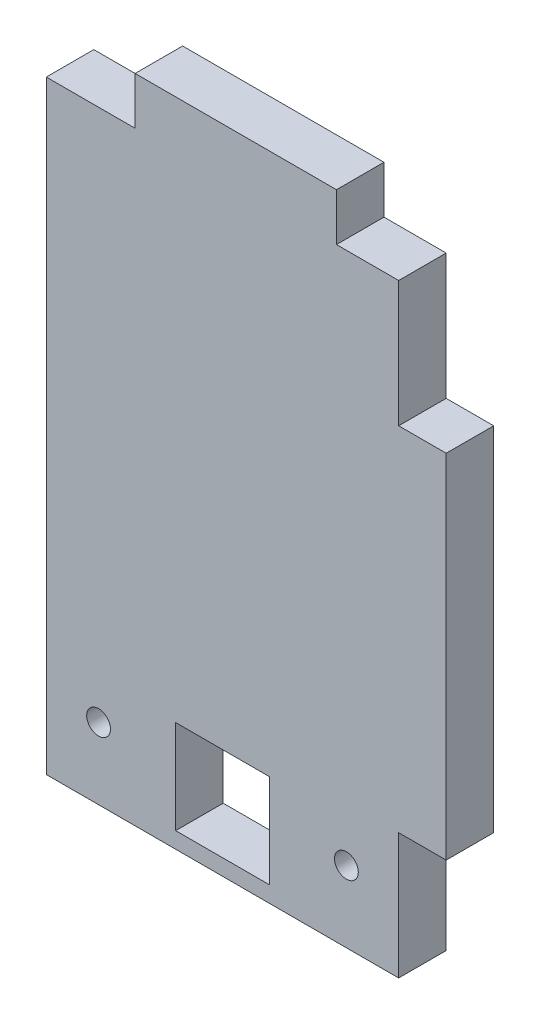
ISO-10303-21;
HEADER;
FILE_DESCRIPTION(('STEP AP214'),'2;1');
FILE_NAME('part.step','',(''),(''),'','','');
FILE_SCHEMA(('AUTOMOTIVE_DESIGN { 1 0 10303 214 1 1 1 1 }'));
ENDSEC;
DATA;
#1=APPLICATION_CONTEXT('core data for automotive mechanical design processes');
#2=APPLICATION_PROTOCOL_DEFINITION('international standard','automotive_design',2000,#1);
#3=PRODUCT_CONTEXT('',#1,'mechanical');
#4=PRODUCT('Part','Part','',(#3));
#5=PRODUCT_RELATED_PRODUCT_CATEGORY('part','',(#4));
#6=PRODUCT_DEFINITION_FORMATION('','',#4);
#7=PRODUCT_DEFINITION_CONTEXT('part definition',#1,'design');
#8=PRODUCT_DEFINITION('design','',#6,#7);
#9=PRODUCT_DEFINITION_SHAPE('','',#8);
#10=(LENGTH_UNIT() NAMED_UNIT(*) SI_UNIT(.MILLI.,.METRE.));
#11=(NAMED_UNIT(*) PLANE_ANGLE_UNIT() SI_UNIT($,.RADIAN.));
#12=(NAMED_UNIT(*) SI_UNIT($,.STERADIAN.) SOLID_ANGLE_UNIT());
#13=UNCERTAINTY_MEASURE_WITH_UNIT(LENGTH_MEASURE(1.E-05),#10,'distance_accuracy_value','');
#14=(GEOMETRIC_REPRESENTATION_CONTEXT(3) GLOBAL_UNCERTAINTY_ASSIGNED_CONTEXT((#13)) GLOBAL_UNIT_ASSIGNED_CONTEXT((#10,
#11,#12)) REPRESENTATION_CONTEXT('',''));
#15=CARTESIAN_POINT('',(0.,0.,0.));
#16=DIRECTION('',(0.,0.,1.));
#17=DIRECTION('',(1.,0.,0.));
#18=AXIS2_PLACEMENT_3D('',#15,#16,#17);
#19=CARTESIAN_POINT('',(0.,0.,5.9944));
#20=DIRECTION('',(0.,0.,1.));
#21=DIRECTION('',(1.,0.,0.));
#22=AXIS2_PLACEMENT_3D('',#19,#20,#21);
#23=PLANE('',#22);
#24=CARTESIAN_POINT('',(37.854999982,-67.199999966,5.9944));
#25=DIRECTION('',(0.,0.,1.));
#26=DIRECTION('',(1.,0.,0.));
#27=AXIS2_PLACEMENT_3D('',#24,#25,#26);
#28=CIRCLE('',#27,1.5);
#29=CARTESIAN_POINT('',(36.354999982,-67.199999966,5.9944));
#30=VERTEX_POINT('',#29);
#31=EDGE_CURVE('E195',#30,#30,#28,.T.);
#32=ORIENTED_EDGE('',*,*,#31,.F.);
#33=EDGE_LOOP('',(#32));
#34=FACE_BOUND('',#33,.T.);
#35=DIRECTION('',(0.,-1.,0.));
#36=VECTOR('',#35,1.);
#37=CARTESIAN_POINT('',(0.,0.,5.9944));
#38=LINE('',#37,#36);
#39=CARTESIAN_POINT('',(0.,0.,5.9944));
#40=VERTEX_POINT('',#39);
#41=CARTESIAN_POINT('',(0.,-76.2,5.9944));
#42=VERTEX_POINT('',#41);
#43=EDGE_CURVE('E201',#40,#42,#38,.T.);
#44=ORIENTED_EDGE('',*,*,#43,.T.);
#45=DIRECTION('',(1.,0.,0.));
#46=VECTOR('',#45,1.);
#47=CARTESIAN_POINT('',(0.,-76.2,5.9944));
#48=LINE('',#47,#46);
#49=CARTESIAN_POINT('',(44.45,-76.2,5.9944));
#50=VERTEX_POINT('',#49);
#51=EDGE_CURVE('E204',#42,#50,#48,.T.);
#52=ORIENTED_EDGE('',*,*,#51,.T.);
#53=DIRECTION('',(0.,1.,0.));
#54=VECTOR('',#53,1.);
#55=CARTESIAN_POINT('',(44.45,-60.325,5.9944));
#56=LINE('',#55,#54);
#57=CARTESIAN_POINT('',(44.45,-60.325,5.9944));
#58=VERTEX_POINT('',#57);
#59=EDGE_CURVE('E207',#50,#58,#56,.T.);
#60=ORIENTED_EDGE('',*,*,#59,.T.);
#61=DIRECTION('',(1.,0.,0.));
#62=VECTOR('',#61,1.);
#63=CARTESIAN_POINT('',(44.45,-60.325,5.9944));
#64=LINE('',#63,#62);
#65=CARTESIAN_POINT('',(50.4444,-60.325,5.9944));
#66=VERTEX_POINT('',#65);
#67=EDGE_CURVE('E209',#58,#66,#64,.T.);
#68=ORIENTED_EDGE('',*,*,#67,.T.);
#69=DIRECTION('',(0.,1.,0.));
#70=VECTOR('',#69,1.);
#71=CARTESIAN_POINT('',(50.4444,-60.325,5.9944));
#72=LINE('',#71,#70);
#73=CARTESIAN_POINT('',(50.4444,-15.875,5.9944));
#74=VERTEX_POINT('',#73);
#75=EDGE_CURVE('E211',#66,#74,#72,.T.);
#76=ORIENTED_EDGE('',*,*,#75,.T.);
#77=DIRECTION('',(-1.,0.,0.));
#78=VECTOR('',#77,1.);
#79=CARTESIAN_POINT('',(50.4444,-15.875,5.9944));
#80=LINE('',#79,#78);
#81=CARTESIAN_POINT('',(44.45,-15.875,5.9944));
#82=VERTEX_POINT('',#81);
#83=EDGE_CURVE('E213',#74,#82,#80,.T.);
#84=ORIENTED_EDGE('',*,*,#83,.T.);
#85=DIRECTION('',(0.,1.,0.));
#86=VECTOR('',#85,1.);
#87=CARTESIAN_POINT('',(44.45,0.,5.9944));
#88=LINE('',#87,#86);
#89=CARTESIAN_POINT('',(44.45,0.,5.9944));
#90=VERTEX_POINT('',#89);
#91=EDGE_CURVE('E215',#82,#90,#88,.T.);
#92=ORIENTED_EDGE('',*,*,#91,.T.);
#93=DIRECTION('',(-1.,0.,0.));
#94=VECTOR('',#93,1.);
#95=CARTESIAN_POINT('',(36.6034894811927,0.,5.9944));
#96=LINE('',#95,#94);
#97=CARTESIAN_POINT('',(36.6034894811927,0.,5.9944));
#98=VERTEX_POINT('',#97);
#99=EDGE_CURVE('E217',#90,#98,#96,.T.);
#100=ORIENTED_EDGE('',*,*,#99,.T.);
#101=DIRECTION('',(0.,1.,0.));
#102=VECTOR('',#101,1.);
#103=CARTESIAN_POINT('',(36.6034894811927,5.9944,5.9944));
#104=LINE('',#103,#102);
#105=CARTESIAN_POINT('',(36.6034894811927,5.9944,5.9944));
#106=VERTEX_POINT('',#105);
#107=EDGE_CURVE('E219',#98,#106,#104,.T.);
#108=ORIENTED_EDGE('',*,*,#107,.T.);
#109=DIRECTION('',(-1.,0.,0.));
#110=VECTOR('',#109,1.);
#111=CARTESIAN_POINT('',(11.2034894811927,5.9944,5.9944));
#112=LINE('',#111,#110);
#113=CARTESIAN_POINT('',(11.2034894811927,5.9944,5.9944));
#114=VERTEX_POINT('',#113);
#115=EDGE_CURVE('E221',#106,#114,#112,.T.);
#116=ORIENTED_EDGE('',*,*,#115,.T.);
#117=DIRECTION('',(0.,-1.,0.));
#118=VECTOR('',#117,1.);
#119=CARTESIAN_POINT('',(11.2034894811927,0.,5.9944));
#120=LINE('',#119,#118);
#121=CARTESIAN_POINT('',(11.2034894811927,0.,5.9944));
#122=VERTEX_POINT('',#121);
#123=EDGE_CURVE('E223',#114,#122,#120,.T.);
#124=ORIENTED_EDGE('',*,*,#123,.T.);
#125=DIRECTION('',(-1.,0.,0.));
#126=VECTOR('',#125,1.);
#127=CARTESIAN_POINT('',(0.,0.,5.9944));
#128=LINE('',#127,#126);
#129=EDGE_CURVE('E225',#122,#40,#128,.T.);
#130=ORIENTED_EDGE('',*,*,#129,.T.);
#131=EDGE_LOOP('',(#44,#52,#60,#68,#76,#84,#92,#100,#108,#116,#124,#130));
#132=FACE_BOUND('',#131,.T.);
#133=CARTESIAN_POINT('',(6.595000018,-67.199999966,5.9944));
#134=DIRECTION('',(0.,0.,1.));
#135=DIRECTION('',(1.,0.,0.));
#136=AXIS2_PLACEMENT_3D('',#133,#134,#135);
#137=CIRCLE('',#136,1.5);
#138=CARTESIAN_POINT('',(5.095000018,-67.199999966,5.9944));
#139=VERTEX_POINT('',#138);
#140=EDGE_CURVE('E189',#139,#139,#137,.T.);
#141=ORIENTED_EDGE('',*,*,#140,.F.);
#142=EDGE_LOOP('',(#141));
#143=FACE_BOUND('',#142,.T.);
#144=DIRECTION('',(1.,0.,0.));
#145=VECTOR('',#144,1.);
#146=CARTESIAN_POINT('',(16.3195,-74.168,5.9944));
#147=LINE('',#146,#145);
#148=CARTESIAN_POINT('',(16.3195,-74.168,5.9944));
#149=VERTEX_POINT('',#148);
#150=CARTESIAN_POINT('',(28.1305,-74.168,5.9944));
#151=VERTEX_POINT('',#150);
#152=EDGE_CURVE('E161',#149,#151,#147,.T.);
#153=ORIENTED_EDGE('',*,*,#152,.F.);
#154=DIRECTION('',(0.,-1.,0.));
#155=VECTOR('',#154,1.);
#156=CARTESIAN_POINT('',(16.3195,-62.357,5.9944));
#157=LINE('',#156,#155);
#158=CARTESIAN_POINT('',(16.3195,-62.357,5.9944));
#159=VERTEX_POINT('',#158);
#160=EDGE_CURVE('E153',#159,#149,#157,.T.);
#161=ORIENTED_EDGE('',*,*,#160,.F.);
#162=DIRECTION('',(-1.,0.,0.));
#163=VECTOR('',#162,1.);
#164=CARTESIAN_POINT('',(16.3195,-62.357,5.9944));
#165=LINE('',#164,#163);
#166=CARTESIAN_POINT('',(28.1305,-62.357,5.9944));
#167=VERTEX_POINT('',#166);
#168=EDGE_CURVE('E175',#167,#159,#165,.T.);
#169=ORIENTED_EDGE('',*,*,#168,.F.);
#170=DIRECTION('',(0.,1.,0.));
#171=VECTOR('',#170,1.);
#172=CARTESIAN_POINT('',(28.1305,-62.357,5.9944));
#173=LINE('',#172,#171);
#174=EDGE_CURVE('E173',#151,#167,#173,.T.);
#175=ORIENTED_EDGE('',*,*,#174,.F.);
#176=EDGE_LOOP('',(#153,#161,#169,#175));
#177=FACE_BOUND('',#176,.T.);
#178=ADVANCED_FACE('F40',(#34,#132,#143,#177),#23,.T.);
#179=CARTESIAN_POINT('',(0.,0.,0.));
#180=DIRECTION('',(0.,0.,1.));
#181=DIRECTION('',(1.,0.,0.));
#182=AXIS2_PLACEMENT_3D('',#179,#180,#181);
#183=PLANE('',#182);
#184=CARTESIAN_POINT('',(6.595000018,-67.199999966,0.));
#185=DIRECTION('',(0.,0.,1.));
#186=DIRECTION('',(1.,0.,0.));
#187=AXIS2_PLACEMENT_3D('',#184,#185,#186);
#188=CIRCLE('',#187,1.5);
#189=CARTESIAN_POINT('',(5.095000018,-67.199999966,0.));
#190=VERTEX_POINT('',#189);
#191=EDGE_CURVE('E169',#190,#190,#188,.T.);
#192=ORIENTED_EDGE('',*,*,#191,.T.);
#193=EDGE_LOOP('',(#192));
#194=FACE_BOUND('',#193,.T.);
#195=CARTESIAN_POINT('',(37.854999982,-67.199999966,0.));
#196=DIRECTION('',(0.,0.,1.));
#197=DIRECTION('',(1.,0.,0.));
#198=AXIS2_PLACEMENT_3D('',#195,#196,#197);
#199=CIRCLE('',#198,1.5);
#200=CARTESIAN_POINT('',(36.354999982,-67.199999966,0.));
#201=VERTEX_POINT('',#200);
#202=EDGE_CURVE('E192',#201,#201,#199,.T.);
#203=ORIENTED_EDGE('',*,*,#202,.T.);
#204=EDGE_LOOP('',(#203));
#205=FACE_BOUND('',#204,.T.);
#206=DIRECTION('',(0.,-1.,0.));
#207=VECTOR('',#206,1.);
#208=CARTESIAN_POINT('',(0.,0.,0.));
#209=LINE('',#208,#207);
#210=CARTESIAN_POINT('',(0.,0.,0.));
#211=VERTEX_POINT('',#210);
#212=CARTESIAN_POINT('',(0.,-76.2,0.));
#213=VERTEX_POINT('',#212);
#214=EDGE_CURVE('E198',#211,#213,#209,.T.);
#215=ORIENTED_EDGE('',*,*,#214,.F.);
#216=DIRECTION('',(-1.,0.,0.));
#217=VECTOR('',#216,1.);
#218=CARTESIAN_POINT('',(0.,0.,0.));
#219=LINE('',#218,#217);
#220=CARTESIAN_POINT('',(11.2034894811927,0.,0.));
#221=VERTEX_POINT('',#220);
#222=EDGE_CURVE('E205',#221,#211,#219,.T.);
#223=ORIENTED_EDGE('',*,*,#222,.F.);
#224=DIRECTION('',(0.,-1.,0.));
#225=VECTOR('',#224,1.);
#226=CARTESIAN_POINT('',(11.2034894811927,0.,0.));
#227=LINE('',#226,#225);
#228=CARTESIAN_POINT('',(11.2034894811927,5.9944,0.));
#229=VERTEX_POINT('',#228);
#230=EDGE_CURVE('E248',#229,#221,#227,.T.);
#231=ORIENTED_EDGE('',*,*,#230,.F.);
#232=DIRECTION('',(-1.,0.,0.));
#233=VECTOR('',#232,1.);
#234=CARTESIAN_POINT('',(11.2034894811927,5.9944,0.));
#235=LINE('',#234,#233);
#236=CARTESIAN_POINT('',(36.6034894811927,5.9944,0.));
#237=VERTEX_POINT('',#236);
#238=EDGE_CURVE('E246',#237,#229,#235,.T.);
#239=ORIENTED_EDGE('',*,*,#238,.F.);
#240=DIRECTION('',(0.,1.,0.));
#241=VECTOR('',#240,1.);
#242=CARTESIAN_POINT('',(36.6034894811927,5.9944,0.));
#243=LINE('',#242,#241);
#244=CARTESIAN_POINT('',(36.6034894811927,0.,0.));
#245=VERTEX_POINT('',#244);
#246=EDGE_CURVE('E244',#245,#237,#243,.T.);
#247=ORIENTED_EDGE('',*,*,#246,.F.);
#248=DIRECTION('',(-1.,0.,0.));
#249=VECTOR('',#248,1.);
#250=CARTESIAN_POINT('',(36.6034894811927,0.,0.));
#251=LINE('',#250,#249);
#252=CARTESIAN_POINT('',(44.45,0.,0.));
#253=VERTEX_POINT('',#252);
#254=EDGE_CURVE('E242',#253,#245,#251,.T.);
#255=ORIENTED_EDGE('',*,*,#254,.F.);
#256=DIRECTION('',(0.,1.,0.));
#257=VECTOR('',#256,1.);
#258=CARTESIAN_POINT('',(44.45,0.,0.));
#259=LINE('',#258,#257);
#260=CARTESIAN_POINT('',(44.45,-15.875,0.));
#261=VERTEX_POINT('',#260);
#262=EDGE_CURVE('E240',#261,#253,#259,.T.);
#263=ORIENTED_EDGE('',*,*,#262,.F.);
#264=DIRECTION('',(-1.,0.,0.));
#265=VECTOR('',#264,1.);
#266=CARTESIAN_POINT('',(50.4444,-15.875,0.));
#267=LINE('',#266,#265);
#268=CARTESIAN_POINT('',(50.4444,-15.875,0.));
#269=VERTEX_POINT('',#268);
#270=EDGE_CURVE('E238',#269,#261,#267,.T.);
#271=ORIENTED_EDGE('',*,*,#270,.F.);
#272=DIRECTION('',(0.,1.,0.));
#273=VECTOR('',#272,1.);
#274=CARTESIAN_POINT('',(50.4444,-60.325,0.));
#275=LINE('',#274,#273);
#276=CARTESIAN_POINT('',(50.4444,-60.325,0.));
#277=VERTEX_POINT('',#276);
#278=EDGE_CURVE('E236',#277,#269,#275,.T.);
#279=ORIENTED_EDGE('',*,*,#278,.F.);
#280=DIRECTION('',(1.,0.,0.));
#281=VECTOR('',#280,1.);
#282=CARTESIAN_POINT('',(44.45,-60.325,0.));
#283=LINE('',#282,#281);
#284=CARTESIAN_POINT('',(44.45,-60.325,0.));
#285=VERTEX_POINT('',#284);
#286=EDGE_CURVE('E234',#285,#277,#283,.T.);
#287=ORIENTED_EDGE('',*,*,#286,.F.);
#288=DIRECTION('',(0.,1.,0.));
#289=VECTOR('',#288,1.);
#290=CARTESIAN_POINT('',(44.45,-60.325,0.));
#291=LINE('',#290,#289);
#292=CARTESIAN_POINT('',(44.45,-76.2,0.));
#293=VERTEX_POINT('',#292);
#294=EDGE_CURVE('E232',#293,#285,#291,.T.);
#295=ORIENTED_EDGE('',*,*,#294,.F.);
#296=DIRECTION('',(1.,0.,0.));
#297=VECTOR('',#296,1.);
#298=CARTESIAN_POINT('',(0.,-76.2,0.));
#299=LINE('',#298,#297);
#300=EDGE_CURVE('E230',#213,#293,#299,.T.);
#301=ORIENTED_EDGE('',*,*,#300,.F.);
#302=EDGE_LOOP('',(#215,#223,#231,#239,#247,#255,#263,#271,#279,#287,#295,#301));
#303=FACE_BOUND('',#302,.T.);
#304=DIRECTION('',(0.,-1.,0.));
#305=VECTOR('',#304,1.);
#306=CARTESIAN_POINT('',(16.3195,-62.357,0.));
#307=LINE('',#306,#305);
#308=CARTESIAN_POINT('',(16.3195,-62.357,0.));
#309=VERTEX_POINT('',#308);
#310=CARTESIAN_POINT('',(16.3195,-74.168,0.));
#311=VERTEX_POINT('',#310);
#312=EDGE_CURVE('E63',#309,#311,#307,.T.);
#313=ORIENTED_EDGE('',*,*,#312,.T.);
#314=DIRECTION('',(1.,0.,0.));
#315=VECTOR('',#314,1.);
#316=CARTESIAN_POINT('',(16.3195,-74.168,0.));
#317=LINE('',#316,#315);
#318=CARTESIAN_POINT('',(28.1305,-74.168,0.));
#319=VERTEX_POINT('',#318);
#320=EDGE_CURVE('E168',#311,#319,#317,.T.);
#321=ORIENTED_EDGE('',*,*,#320,.T.);
#322=DIRECTION('',(0.,1.,0.));
#323=VECTOR('',#322,1.);
#324=CARTESIAN_POINT('',(28.1305,-62.357,0.));
#325=LINE('',#324,#323);
#326=CARTESIAN_POINT('',(28.1305,-62.357,0.));
#327=VERTEX_POINT('',#326);
#328=EDGE_CURVE('E181',#319,#327,#325,.T.);
#329=ORIENTED_EDGE('',*,*,#328,.T.);
#330=DIRECTION('',(-1.,0.,0.));
#331=VECTOR('',#330,1.);
#332=CARTESIAN_POINT('',(16.3195,-62.357,0.));
#333=LINE('',#332,#331);
#334=EDGE_CURVE('E162',#327,#309,#333,.T.);
#335=ORIENTED_EDGE('',*,*,#334,.T.);
#336=EDGE_LOOP('',(#313,#321,#329,#335));
#337=FACE_BOUND('',#336,.T.);
#338=ADVANCED_FACE('F290',(#194,#205,#303,#337),#183,.F.);
#339=CARTESIAN_POINT('',(0.,0.,5.9944));
#340=DIRECTION('',(1.,0.,0.));
#341=DIRECTION('',(0.,1.,0.));
#342=AXIS2_PLACEMENT_3D('',#339,#340,#341);
#343=PLANE('',#342);
#344=ORIENTED_EDGE('',*,*,#214,.T.);
#345=DIRECTION('',(0.,0.,-1.));
#346=VECTOR('',#345,1.);
#347=CARTESIAN_POINT('',(0.,-76.2,5.9944));
#348=LINE('',#347,#346);
#349=EDGE_CURVE('E11',#42,#213,#348,.T.);
#350=ORIENTED_EDGE('',*,*,#349,.F.);
#351=ORIENTED_EDGE('',*,*,#43,.F.);
#352=DIRECTION('',(0.,0.,-1.));
#353=VECTOR('',#352,1.);
#354=CARTESIAN_POINT('',(0.,0.,5.9944));
#355=LINE('',#354,#353);
#356=EDGE_CURVE('E227',#40,#211,#355,.T.);
#357=ORIENTED_EDGE('',*,*,#356,.T.);
#358=EDGE_LOOP('',(#344,#350,#351,#357));
#359=FACE_BOUND('',#358,.T.);
#360=ADVANCED_FACE('F42',(#359),#343,.F.);
#361=CARTESIAN_POINT('',(0.,-76.2,5.9944));
#362=DIRECTION('',(0.,1.,0.));
#363=DIRECTION('',(0.,0.,1.));
#364=AXIS2_PLACEMENT_3D('',#361,#362,#363);
#365=PLANE('',#364);
#366=ORIENTED_EDGE('',*,*,#300,.T.);
#367=DIRECTION('',(0.,0.,-1.));
#368=VECTOR('',#367,1.);
#369=CARTESIAN_POINT('',(44.45,-76.2,5.9944));
#370=LINE('',#369,#368);
#371=EDGE_CURVE('E48',#50,#293,#370,.T.);
#372=ORIENTED_EDGE('',*,*,#371,.F.);
#373=ORIENTED_EDGE('',*,*,#51,.F.);
#374=ORIENTED_EDGE('',*,*,#349,.T.);
#375=EDGE_LOOP('',(#366,#372,#373,#374));
#376=FACE_BOUND('',#375,.T.);
#377=ADVANCED_FACE('F308',(#376),#365,.F.);
#378=CARTESIAN_POINT('',(44.45,-60.325,5.9944));
#379=DIRECTION('',(-1.,0.,0.));
#380=DIRECTION('',(0.,0.,1.));
#381=AXIS2_PLACEMENT_3D('',#378,#379,#380);
#382=PLANE('',#381);
#383=ORIENTED_EDGE('',*,*,#294,.T.);
#384=DIRECTION('',(0.,0.,-1.));
#385=VECTOR('',#384,1.);
#386=CARTESIAN_POINT('',(44.45,-60.325,5.9944));
#387=LINE('',#386,#385);
#388=EDGE_CURVE('E277',#58,#285,#387,.T.);
#389=ORIENTED_EDGE('',*,*,#388,.F.);
#390=ORIENTED_EDGE('',*,*,#59,.F.);
#391=ORIENTED_EDGE('',*,*,#371,.T.);
#392=EDGE_LOOP('',(#383,#389,#390,#391));
#393=FACE_BOUND('',#392,.T.);
#394=ADVANCED_FACE('F284',(#393),#382,.F.);
#395=CARTESIAN_POINT('',(44.45,-60.325,5.9944));
#396=DIRECTION('',(0.,1.,0.));
#397=DIRECTION('',(0.,0.,1.));
#398=AXIS2_PLACEMENT_3D('',#395,#396,#397);
#399=PLANE('',#398);
#400=ORIENTED_EDGE('',*,*,#286,.T.);
#401=DIRECTION('',(0.,0.,-1.));
#402=VECTOR('',#401,1.);
#403=CARTESIAN_POINT('',(50.4444,-60.325,5.9944));
#404=LINE('',#403,#402);
#405=EDGE_CURVE('E274',#66,#277,#404,.T.);
#406=ORIENTED_EDGE('',*,*,#405,.F.);
#407=ORIENTED_EDGE('',*,*,#67,.F.);
#408=ORIENTED_EDGE('',*,*,#388,.T.);
#409=EDGE_LOOP('',(#400,#406,#407,#408));
#410=FACE_BOUND('',#409,.T.);
#411=ADVANCED_FACE('F296',(#410),#399,.F.);
#412=CARTESIAN_POINT('',(50.4444,-60.325,5.9944));
#413=DIRECTION('',(-1.,0.,0.));
#414=DIRECTION('',(0.,0.,1.));
#415=AXIS2_PLACEMENT_3D('',#412,#413,#414);
#416=PLANE('',#415);
#417=ORIENTED_EDGE('',*,*,#278,.T.);
#418=DIRECTION('',(0.,0.,-1.));
#419=VECTOR('',#418,1.);
#420=CARTESIAN_POINT('',(50.4444,-15.875,5.9944));
#421=LINE('',#420,#419);
#422=EDGE_CURVE('E271',#74,#269,#421,.T.);
#423=ORIENTED_EDGE('',*,*,#422,.F.);
#424=ORIENTED_EDGE('',*,*,#75,.F.);
#425=ORIENTED_EDGE('',*,*,#405,.T.);
#426=EDGE_LOOP('',(#417,#423,#424,#425));
#427=FACE_BOUND('',#426,.T.);
#428=ADVANCED_FACE('F300',(#427),#416,.F.);
#429=CARTESIAN_POINT('',(50.4444,-15.875,5.9944));
#430=DIRECTION('',(0.,-1.,0.));
#431=DIRECTION('',(0.,0.,-1.));
#432=AXIS2_PLACEMENT_3D('',#429,#430,#431);
#433=PLANE('',#432);
#434=ORIENTED_EDGE('',*,*,#270,.T.);
#435=DIRECTION('',(0.,0.,-1.));
#436=VECTOR('',#435,1.);
#437=CARTESIAN_POINT('',(44.45,-15.875,5.9944));
#438=LINE('',#437,#436);
#439=EDGE_CURVE('E268',#82,#261,#438,.T.);
#440=ORIENTED_EDGE('',*,*,#439,.F.);
#441=ORIENTED_EDGE('',*,*,#83,.F.);
#442=ORIENTED_EDGE('',*,*,#422,.T.);
#443=EDGE_LOOP('',(#434,#440,#441,#442));
#444=FACE_BOUND('',#443,.T.);
#445=ADVANCED_FACE('F341',(#444),#433,.F.);
#446=CARTESIAN_POINT('',(44.45,0.,5.9944));
#447=DIRECTION('',(-1.,0.,0.));
#448=DIRECTION('',(0.,-1.,0.));
#449=AXIS2_PLACEMENT_3D('',#446,#447,#448);
#450=PLANE('',#449);
#451=ORIENTED_EDGE('',*,*,#262,.T.);
#452=DIRECTION('',(0.,0.,-1.));
#453=VECTOR('',#452,1.);
#454=CARTESIAN_POINT('',(44.45,0.,5.9944));
#455=LINE('',#454,#453);
#456=EDGE_CURVE('E265',#90,#253,#455,.T.);
#457=ORIENTED_EDGE('',*,*,#456,.F.);
#458=ORIENTED_EDGE('',*,*,#91,.F.);
#459=ORIENTED_EDGE('',*,*,#439,.T.);
#460=EDGE_LOOP('',(#451,#457,#458,#459));
#461=FACE_BOUND('',#460,.T.);
#462=ADVANCED_FACE('F339',(#461),#450,.F.);
#463=CARTESIAN_POINT('',(36.6034894811927,0.,5.9944));
#464=DIRECTION('',(0.,-1.,0.));
#465=DIRECTION('',(0.,0.,-1.));
#466=AXIS2_PLACEMENT_3D('',#463,#464,#465);
#467=PLANE('',#466);
#468=ORIENTED_EDGE('',*,*,#254,.T.);
#469=DIRECTION('',(0.,0.,-1.));
#470=VECTOR('',#469,1.);
#471=CARTESIAN_POINT('',(36.6034894811927,0.,5.9944));
#472=LINE('',#471,#470);
#473=EDGE_CURVE('E262',#98,#245,#472,.T.);
#474=ORIENTED_EDGE('',*,*,#473,.F.);
#475=ORIENTED_EDGE('',*,*,#99,.F.);
#476=ORIENTED_EDGE('',*,*,#456,.T.);
#477=EDGE_LOOP('',(#468,#474,#475,#476));
#478=FACE_BOUND('',#477,.T.);
#479=ADVANCED_FACE('F335',(#478),#467,.F.);
#480=CARTESIAN_POINT('',(36.6034894811927,5.9944,5.9944));
#481=DIRECTION('',(-1.,0.,0.));
#482=DIRECTION('',(0.,0.,1.));
#483=AXIS2_PLACEMENT_3D('',#480,#481,#482);
#484=PLANE('',#483);
#485=ORIENTED_EDGE('',*,*,#246,.T.);
#486=DIRECTION('',(0.,0.,-1.));
#487=VECTOR('',#486,1.);
#488=CARTESIAN_POINT('',(36.6034894811927,5.9944,5.9944));
#489=LINE('',#488,#487);
#490=EDGE_CURVE('E259',#106,#237,#489,.T.);
#491=ORIENTED_EDGE('',*,*,#490,.F.);
#492=ORIENTED_EDGE('',*,*,#107,.F.);
#493=ORIENTED_EDGE('',*,*,#473,.T.);
#494=EDGE_LOOP('',(#485,#491,#492,#493));
#495=FACE_BOUND('',#494,.T.);
#496=ADVANCED_FACE('F330',(#495),#484,.F.);
#497=CARTESIAN_POINT('',(11.2034894811927,5.9944,5.9944));
#498=DIRECTION('',(0.,-1.,0.));
#499=DIRECTION('',(0.,0.,-1.));
#500=AXIS2_PLACEMENT_3D('',#497,#498,#499);
#501=PLANE('',#500);
#502=ORIENTED_EDGE('',*,*,#238,.T.);
#503=DIRECTION('',(0.,0.,-1.));
#504=VECTOR('',#503,1.);
#505=CARTESIAN_POINT('',(11.2034894811927,5.9944,5.9944));
#506=LINE('',#505,#504);
#507=EDGE_CURVE('E256',#114,#229,#506,.T.);
#508=ORIENTED_EDGE('',*,*,#507,.F.);
#509=ORIENTED_EDGE('',*,*,#115,.F.);
#510=ORIENTED_EDGE('',*,*,#490,.T.);
#511=EDGE_LOOP('',(#502,#508,#509,#510));
#512=FACE_BOUND('',#511,.T.);
#513=ADVANCED_FACE('F324',(#512),#501,.F.);
#514=CARTESIAN_POINT('',(11.2034894811927,0.,5.9944));
#515=DIRECTION('',(1.,0.,0.));
#516=DIRECTION('',(0.,0.,-1.));
#517=AXIS2_PLACEMENT_3D('',#514,#515,#516);
#518=PLANE('',#517);
#519=ORIENTED_EDGE('',*,*,#230,.T.);
#520=DIRECTION('',(0.,0.,-1.));
#521=VECTOR('',#520,1.);
#522=CARTESIAN_POINT('',(11.2034894811927,0.,5.9944));
#523=LINE('',#522,#521);
#524=EDGE_CURVE('E253',#122,#221,#523,.T.);
#525=ORIENTED_EDGE('',*,*,#524,.F.);
#526=ORIENTED_EDGE('',*,*,#123,.F.);
#527=ORIENTED_EDGE('',*,*,#507,.T.);
#528=EDGE_LOOP('',(#519,#525,#526,#527));
#529=FACE_BOUND('',#528,.T.);
#530=ADVANCED_FACE('F320',(#529),#518,.F.);
#531=CARTESIAN_POINT('',(0.,0.,5.9944));
#532=DIRECTION('',(0.,-1.,0.));
#533=DIRECTION('',(0.,0.,-1.));
#534=AXIS2_PLACEMENT_3D('',#531,#532,#533);
#535=PLANE('',#534);
#536=ORIENTED_EDGE('',*,*,#222,.T.);
#537=ORIENTED_EDGE('',*,*,#356,.F.);
#538=ORIENTED_EDGE('',*,*,#129,.F.);
#539=ORIENTED_EDGE('',*,*,#524,.T.);
#540=EDGE_LOOP('',(#536,#537,#538,#539));
#541=FACE_BOUND('',#540,.T.);
#542=ADVANCED_FACE('F315',(#541),#535,.F.);
#543=CARTESIAN_POINT('',(37.854999982,-67.199999966,5.9944));
#544=DIRECTION('',(0.,0.,-1.));
#545=DIRECTION('',(-1.,0.,0.));
#546=AXIS2_PLACEMENT_3D('',#543,#544,#545);
#547=CYLINDRICAL_SURFACE('',#546,1.5);
#548=CARTESIAN_POINT('',(36.354999982,-67.199999966,5.9944));
#549=CARTESIAN_POINT('',(36.354999982,-67.199999966,5.93195833333333));
#550=CARTESIAN_POINT('',(36.354999982,-67.199999966,5.86951666666667));
#551=CARTESIAN_POINT('',(36.354999982,-67.199999966,5.74463333333333));
#552=CARTESIAN_POINT('',(36.354999982,-67.199999966,5.68219166666667));
#553=CARTESIAN_POINT('',(36.354999982,-67.199999966,5.55730833333333));
#554=CARTESIAN_POINT('',(36.354999982,-67.199999966,5.49486666666667));
#555=CARTESIAN_POINT('',(36.354999982,-67.199999966,5.36998333333333));
#556=CARTESIAN_POINT('',(36.354999982,-67.199999966,5.30754166666667));
#557=CARTESIAN_POINT('',(36.354999982,-67.199999966,5.18265833333333));
#558=CARTESIAN_POINT('',(36.354999982,-67.199999966,5.12021666666667));
#559=CARTESIAN_POINT('',(36.354999982,-67.199999966,4.99533333333333));
#560=CARTESIAN_POINT('',(36.354999982,-67.199999966,4.93289166666667));
#561=CARTESIAN_POINT('',(36.354999982,-67.199999966,4.80800833333333));
#562=CARTESIAN_POINT('',(36.354999982,-67.199999966,4.74556666666667));
#563=CARTESIAN_POINT('',(36.354999982,-67.199999966,4.62068333333333));
#564=CARTESIAN_POINT('',(36.354999982,-67.199999966,4.55824166666667));
#565=CARTESIAN_POINT('',(36.354999982,-67.199999966,4.43335833333333));
#566=CARTESIAN_POINT('',(36.354999982,-67.199999966,4.37091666666667));
#567=CARTESIAN_POINT('',(36.354999982,-67.199999966,4.24603333333333));
#568=CARTESIAN_POINT('',(36.354999982,-67.199999966,4.18359166666667));
#569=CARTESIAN_POINT('',(36.354999982,-67.199999966,4.05870833333333));
#570=CARTESIAN_POINT('',(36.354999982,-67.199999966,3.99626666666667));
#571=CARTESIAN_POINT('',(36.354999982,-67.199999966,3.87138333333333));
#572=CARTESIAN_POINT('',(36.354999982,-67.199999966,3.80894166666667));
#573=CARTESIAN_POINT('',(36.354999982,-67.199999966,3.68405833333333));
#574=CARTESIAN_POINT('',(36.354999982,-67.199999966,3.62161666666667));
#575=CARTESIAN_POINT('',(36.354999982,-67.199999966,3.49673333333333));
#576=CARTESIAN_POINT('',(36.354999982,-67.199999966,3.43429166666667));
#577=CARTESIAN_POINT('',(36.354999982,-67.199999966,3.30940833333333));
#578=CARTESIAN_POINT('',(36.354999982,-67.199999966,3.24696666666667));
#579=CARTESIAN_POINT('',(36.354999982,-67.199999966,3.12208333333333));
#580=CARTESIAN_POINT('',(36.354999982,-67.199999966,3.05964166666667));
#581=CARTESIAN_POINT('',(36.354999982,-67.199999966,2.93475833333333));
#582=CARTESIAN_POINT('',(36.354999982,-67.199999966,2.87231666666667));
#583=CARTESIAN_POINT('',(36.354999982,-67.199999966,2.74743333333333));
#584=CARTESIAN_POINT('',(36.354999982,-67.199999966,2.68499166666667));
#585=CARTESIAN_POINT('',(36.354999982,-67.199999966,2.56010833333333));
#586=CARTESIAN_POINT('',(36.354999982,-67.199999966,2.49766666666667));
#587=CARTESIAN_POINT('',(36.354999982,-67.199999966,2.37278333333333));
#588=CARTESIAN_POINT('',(36.354999982,-67.199999966,2.31034166666667));
#589=CARTESIAN_POINT('',(36.354999982,-67.199999966,2.18545833333333));
#590=CARTESIAN_POINT('',(36.354999982,-67.199999966,2.12301666666667));
#591=CARTESIAN_POINT('',(36.354999982,-67.199999966,1.99813333333333));
#592=CARTESIAN_POINT('',(36.354999982,-67.199999966,1.93569166666667));
#593=CARTESIAN_POINT('',(36.354999982,-67.199999966,1.81080833333333));
#594=CARTESIAN_POINT('',(36.354999982,-67.199999966,1.74836666666667));
#595=CARTESIAN_POINT('',(36.354999982,-67.199999966,1.62348333333333));
#596=CARTESIAN_POINT('',(36.354999982,-67.199999966,1.56104166666667));
#597=CARTESIAN_POINT('',(36.354999982,-67.199999966,1.43615833333333));
#598=CARTESIAN_POINT('',(36.354999982,-67.199999966,1.37371666666667));
#599=CARTESIAN_POINT('',(36.354999982,-67.199999966,1.24883333333333));
#600=CARTESIAN_POINT('',(36.354999982,-67.199999966,1.18639166666667));
#601=CARTESIAN_POINT('',(36.354999982,-67.199999966,1.06150833333333));
#602=CARTESIAN_POINT('',(36.354999982,-67.199999966,0.999066666666667));
#603=CARTESIAN_POINT('',(36.354999982,-67.199999966,0.874183333333333));
#604=CARTESIAN_POINT('',(36.354999982,-67.199999966,0.811741666666666));
#605=CARTESIAN_POINT('',(36.354999982,-67.199999966,0.686858333333333));
#606=CARTESIAN_POINT('',(36.354999982,-67.199999966,0.624416666666667));
#607=CARTESIAN_POINT('',(36.354999982,-67.199999966,0.499533333333333));
#608=CARTESIAN_POINT('',(36.354999982,-67.199999966,0.437091666666667));
#609=CARTESIAN_POINT('',(36.354999982,-67.199999966,0.312208333333333));
#610=CARTESIAN_POINT('',(36.354999982,-67.199999966,0.249766666666667));
#611=CARTESIAN_POINT('',(36.354999982,-67.199999966,0.124883333333334));
#612=CARTESIAN_POINT('',(36.354999982,-67.199999966,0.0624416666666667));
#613=CARTESIAN_POINT('',(36.354999982,-67.199999966,0.));
#614=B_SPLINE_CURVE_WITH_KNOTS('',3,(#548,#549,#550,#551,#552,#553,#554,#555,#556,#557,#558,
#559,#560,#561,#562,#563,#564,#565,#566,#567,#568,#569,#570,#571,#572,#573,#574,#575,#576,#577,
#578,#579,#580,#581,#582,#583,#584,#585,#586,#587,#588,#589,#590,#591,#592,#593,#594,#595,#596,
#597,#598,#599,#600,#601,#602,#603,#604,#605,#606,#607,#608,#609,#610,#611,#612,#613),
.UNSPECIFIED.,.F.,.F.,(4,2,2,2,2,2,2,2,2,2,2,2,2,2,2,2,2,2,2,2,2,2,2,2,2,2,2,2,2,2,2,2,4),(0.,
0.187325,0.374650000000001,0.561975,0.749300000000001,0.936625000000001,1.12395,1.311275,1.4986,
1.685925,1.87325,2.060575,2.2479,2.435225,2.62255,2.809875,2.9972,3.184525,3.37185,3.559175,
3.7465,3.933825,4.12115,4.308475,4.4958,4.683125,4.87045,5.057775,5.2451,5.432425,5.61975,
5.807075,5.9944),.UNSPECIFIED.);
#615=EDGE_CURVE('BSEAM360',#30,#201,#614,.T.);
#616=ORIENTED_EDGE('',*,*,#31,.T.);
#617=ORIENTED_EDGE('',*,*,#202,.F.);
#618=ORIENTED_EDGE('',*,*,#615,.T.);
#619=ORIENTED_EDGE('',*,*,#615,.F.);
#620=EDGE_LOOP('',(#616,#618,#617,#619));
#621=FACE_BOUND('',#620,.T.);
#622=ADVANCED_FACE('F360',(#621),#547,.F.);
#623=CARTESIAN_POINT('',(6.595000018,-67.199999966,5.9944));
#624=DIRECTION('',(0.,0.,-1.));
#625=DIRECTION('',(-1.,0.,0.));
#626=AXIS2_PLACEMENT_3D('',#623,#624,#625);
#627=CYLINDRICAL_SURFACE('',#626,1.5);
#628=CARTESIAN_POINT('',(5.095000018,-67.199999966,5.9944));
#629=CARTESIAN_POINT('',(5.095000018,-67.199999966,5.93195833333333));
#630=CARTESIAN_POINT('',(5.095000018,-67.199999966,5.86951666666667));
#631=CARTESIAN_POINT('',(5.095000018,-67.199999966,5.74463333333333));
#632=CARTESIAN_POINT('',(5.095000018,-67.199999966,5.68219166666667));
#633=CARTESIAN_POINT('',(5.095000018,-67.199999966,5.55730833333333));
#634=CARTESIAN_POINT('',(5.095000018,-67.199999966,5.49486666666667));
#635=CARTESIAN_POINT('',(5.095000018,-67.199999966,5.36998333333333));
#636=CARTESIAN_POINT('',(5.095000018,-67.199999966,5.30754166666667));
#637=CARTESIAN_POINT('',(5.095000018,-67.199999966,5.18265833333333));
#638=CARTESIAN_POINT('',(5.095000018,-67.199999966,5.12021666666667));
#639=CARTESIAN_POINT('',(5.095000018,-67.199999966,4.99533333333333));
#640=CARTESIAN_POINT('',(5.095000018,-67.199999966,4.93289166666667));
#641=CARTESIAN_POINT('',(5.095000018,-67.199999966,4.80800833333333));
#642=CARTESIAN_POINT('',(5.095000018,-67.199999966,4.74556666666667));
#643=CARTESIAN_POINT('',(5.095000018,-67.199999966,4.62068333333333));
#644=CARTESIAN_POINT('',(5.095000018,-67.199999966,4.55824166666667));
#645=CARTESIAN_POINT('',(5.095000018,-67.199999966,4.43335833333333));
#646=CARTESIAN_POINT('',(5.095000018,-67.199999966,4.37091666666667));
#647=CARTESIAN_POINT('',(5.095000018,-67.199999966,4.24603333333333));
#648=CARTESIAN_POINT('',(5.095000018,-67.199999966,4.18359166666667));
#649=CARTESIAN_POINT('',(5.095000018,-67.199999966,4.05870833333333));
#650=CARTESIAN_POINT('',(5.095000018,-67.199999966,3.99626666666667));
#651=CARTESIAN_POINT('',(5.095000018,-67.199999966,3.87138333333333));
#652=CARTESIAN_POINT('',(5.095000018,-67.199999966,3.80894166666667));
#653=CARTESIAN_POINT('',(5.095000018,-67.199999966,3.68405833333333));
#654=CARTESIAN_POINT('',(5.095000018,-67.199999966,3.62161666666667));
#655=CARTESIAN_POINT('',(5.095000018,-67.199999966,3.49673333333333));
#656=CARTESIAN_POINT('',(5.095000018,-67.199999966,3.43429166666667));
#657=CARTESIAN_POINT('',(5.095000018,-67.199999966,3.30940833333333));
#658=CARTESIAN_POINT('',(5.095000018,-67.199999966,3.24696666666667));
#659=CARTESIAN_POINT('',(5.095000018,-67.199999966,3.12208333333333));
#660=CARTESIAN_POINT('',(5.095000018,-67.199999966,3.05964166666667));
#661=CARTESIAN_POINT('',(5.095000018,-67.199999966,2.93475833333333));
#662=CARTESIAN_POINT('',(5.095000018,-67.199999966,2.87231666666667));
#663=CARTESIAN_POINT('',(5.095000018,-67.199999966,2.74743333333333));
#664=CARTESIAN_POINT('',(5.095000018,-67.199999966,2.68499166666667));
#665=CARTESIAN_POINT('',(5.095000018,-67.199999966,2.56010833333333));
#666=CARTESIAN_POINT('',(5.095000018,-67.199999966,2.49766666666667));
#667=CARTESIAN_POINT('',(5.095000018,-67.199999966,2.37278333333333));
#668=CARTESIAN_POINT('',(5.095000018,-67.199999966,2.31034166666667));
#669=CARTESIAN_POINT('',(5.095000018,-67.199999966,2.18545833333333));
#670=CARTESIAN_POINT('',(5.095000018,-67.199999966,2.12301666666667));
#671=CARTESIAN_POINT('',(5.095000018,-67.199999966,1.99813333333333));
#672=CARTESIAN_POINT('',(5.095000018,-67.199999966,1.93569166666667));
#673=CARTESIAN_POINT('',(5.095000018,-67.199999966,1.81080833333333));
#674=CARTESIAN_POINT('',(5.095000018,-67.199999966,1.74836666666667));
#675=CARTESIAN_POINT('',(5.095000018,-67.199999966,1.62348333333333));
#676=CARTESIAN_POINT('',(5.095000018,-67.199999966,1.56104166666667));
#677=CARTESIAN_POINT('',(5.095000018,-67.199999966,1.43615833333333));
#678=CARTESIAN_POINT('',(5.095000018,-67.199999966,1.37371666666667));
#679=CARTESIAN_POINT('',(5.095000018,-67.199999966,1.24883333333333));
#680=CARTESIAN_POINT('',(5.095000018,-67.199999966,1.18639166666667));
#681=CARTESIAN_POINT('',(5.095000018,-67.199999966,1.06150833333333));
#682=CARTESIAN_POINT('',(5.095000018,-67.199999966,0.999066666666667));
#683=CARTESIAN_POINT('',(5.095000018,-67.199999966,0.874183333333333));
#684=CARTESIAN_POINT('',(5.095000018,-67.199999966,0.811741666666666));
#685=CARTESIAN_POINT('',(5.095000018,-67.199999966,0.686858333333333));
#686=CARTESIAN_POINT('',(5.095000018,-67.199999966,0.624416666666667));
#687=CARTESIAN_POINT('',(5.095000018,-67.199999966,0.499533333333333));
#688=CARTESIAN_POINT('',(5.095000018,-67.199999966,0.437091666666667));
#689=CARTESIAN_POINT('',(5.095000018,-67.199999966,0.312208333333333));
#690=CARTESIAN_POINT('',(5.095000018,-67.199999966,0.249766666666667));
#691=CARTESIAN_POINT('',(5.095000018,-67.199999966,0.124883333333334));
#692=CARTESIAN_POINT('',(5.095000018,-67.199999966,0.0624416666666667));
#693=CARTESIAN_POINT('',(5.095000018,-67.199999966,0.));
#694=B_SPLINE_CURVE_WITH_KNOTS('',3,(#628,#629,#630,#631,#632,#633,#634,#635,#636,#637,#638,
#639,#640,#641,#642,#643,#644,#645,#646,#647,#648,#649,#650,#651,#652,#653,#654,#655,#656,#657,
#658,#659,#660,#661,#662,#663,#664,#665,#666,#667,#668,#669,#670,#671,#672,#673,#674,#675,#676,
#677,#678,#679,#680,#681,#682,#683,#684,#685,#686,#687,#688,#689,#690,#691,#692,#693),
.UNSPECIFIED.,.F.,.F.,(4,2,2,2,2,2,2,2,2,2,2,2,2,2,2,2,2,2,2,2,2,2,2,2,2,2,2,2,2,2,2,2,4),(0.,
0.187325,0.374650000000001,0.561975,0.749300000000001,0.936625000000001,1.12395,1.311275,1.4986,
1.685925,1.87325,2.060575,2.2479,2.435225,2.62255,2.809875,2.9972,3.184525,3.37185,3.559175,
3.7465,3.933825,4.12115,4.308475,4.4958,4.683125,4.87045,5.057775,5.2451,5.432425,5.61975,
5.807075,5.9944),.UNSPECIFIED.);
#695=EDGE_CURVE('BSEAM398',#139,#190,#694,.T.);
#696=ORIENTED_EDGE('',*,*,#140,.T.);
#697=ORIENTED_EDGE('',*,*,#191,.F.);
#698=ORIENTED_EDGE('',*,*,#695,.T.);
#699=ORIENTED_EDGE('',*,*,#695,.F.);
#700=EDGE_LOOP('',(#696,#698,#697,#699));
#701=FACE_BOUND('',#700,.T.);
#702=ADVANCED_FACE('F398',(#701),#627,.F.);
#703=CARTESIAN_POINT('',(16.3195,-62.357,5.9944));
#704=DIRECTION('',(1.,0.,0.));
#705=DIRECTION('',(0.,1.,0.));
#706=AXIS2_PLACEMENT_3D('',#703,#704,#705);
#707=PLANE('',#706);
#708=ORIENTED_EDGE('',*,*,#312,.F.);
#709=DIRECTION('',(0.,0.,-1.));
#710=VECTOR('',#709,1.);
#711=CARTESIAN_POINT('',(16.3195,-62.357,5.9944));
#712=LINE('',#711,#710);
#713=EDGE_CURVE('E157',#159,#309,#712,.T.);
#714=ORIENTED_EDGE('',*,*,#713,.F.);
#715=ORIENTED_EDGE('',*,*,#160,.T.);
#716=DIRECTION('',(0.,0.,-1.));
#717=VECTOR('',#716,1.);
#718=CARTESIAN_POINT('',(16.3195,-74.168,5.9944));
#719=LINE('',#718,#717);
#720=EDGE_CURVE('E156',#149,#311,#719,.T.);
#721=ORIENTED_EDGE('',*,*,#720,.T.);
#722=EDGE_LOOP('',(#708,#714,#715,#721));
#723=FACE_BOUND('',#722,.T.);
#724=ADVANCED_FACE('F155',(#723),#707,.T.);
#725=CARTESIAN_POINT('',(16.3195,-74.168,5.9944));
#726=DIRECTION('',(0.,1.,0.));
#727=DIRECTION('',(0.,0.,1.));
#728=AXIS2_PLACEMENT_3D('',#725,#726,#727);
#729=PLANE('',#728);
#730=ORIENTED_EDGE('',*,*,#320,.F.);
#731=ORIENTED_EDGE('',*,*,#720,.F.);
#732=ORIENTED_EDGE('',*,*,#152,.T.);
#733=DIRECTION('',(0.,0.,-1.));
#734=VECTOR('',#733,1.);
#735=CARTESIAN_POINT('',(28.1305,-74.168,5.9944));
#736=LINE('',#735,#734);
#737=EDGE_CURVE('E170',#151,#319,#736,.T.);
#738=ORIENTED_EDGE('',*,*,#737,.T.);
#739=EDGE_LOOP('',(#730,#731,#732,#738));
#740=FACE_BOUND('',#739,.T.);
#741=ADVANCED_FACE('F165',(#740),#729,.T.);
#742=CARTESIAN_POINT('',(28.1305,-62.357,5.9944));
#743=DIRECTION('',(-1.,0.,0.));
#744=DIRECTION('',(0.,-1.,0.));
#745=AXIS2_PLACEMENT_3D('',#742,#743,#744);
#746=PLANE('',#745);
#747=ORIENTED_EDGE('',*,*,#328,.F.);
#748=ORIENTED_EDGE('',*,*,#737,.F.);
#749=ORIENTED_EDGE('',*,*,#174,.T.);
#750=DIRECTION('',(0.,0.,-1.));
#751=VECTOR('',#750,1.);
#752=CARTESIAN_POINT('',(28.1305,-62.357,5.9944));
#753=LINE('',#752,#751);
#754=EDGE_CURVE('E55',#167,#327,#753,.T.);
#755=ORIENTED_EDGE('',*,*,#754,.T.);
#756=EDGE_LOOP('',(#747,#748,#749,#755));
#757=FACE_BOUND('',#756,.T.);
#758=ADVANCED_FACE('F417',(#757),#746,.T.);
#759=CARTESIAN_POINT('',(16.3195,-62.357,5.9944));
#760=DIRECTION('',(0.,-1.,0.));
#761=DIRECTION('',(0.,0.,-1.));
#762=AXIS2_PLACEMENT_3D('',#759,#760,#761);
#763=PLANE('',#762);
#764=ORIENTED_EDGE('',*,*,#334,.F.);
#765=ORIENTED_EDGE('',*,*,#754,.F.);
#766=ORIENTED_EDGE('',*,*,#168,.T.);
#767=ORIENTED_EDGE('',*,*,#713,.T.);
#768=EDGE_LOOP('',(#764,#765,#766,#767));
#769=FACE_BOUND('',#768,.T.);
#770=ADVANCED_FACE('F424',(#769),#763,.T.);
#771=CLOSED_SHELL('',(#178,#338,#360,#377,#394,#411,#428,#445,#462,#479,#496,#513,#530,#542,
#622,#702,#724,#741,#758,#770));
#772=MANIFOLD_SOLID_BREP('B2',#771);
#773=ADVANCED_BREP_SHAPE_REPRESENTATION('',(#18,#772),#14);
#774=SHAPE_DEFINITION_REPRESENTATION(#9,#773);
ENDSEC;
END-ISO-10303-21;
